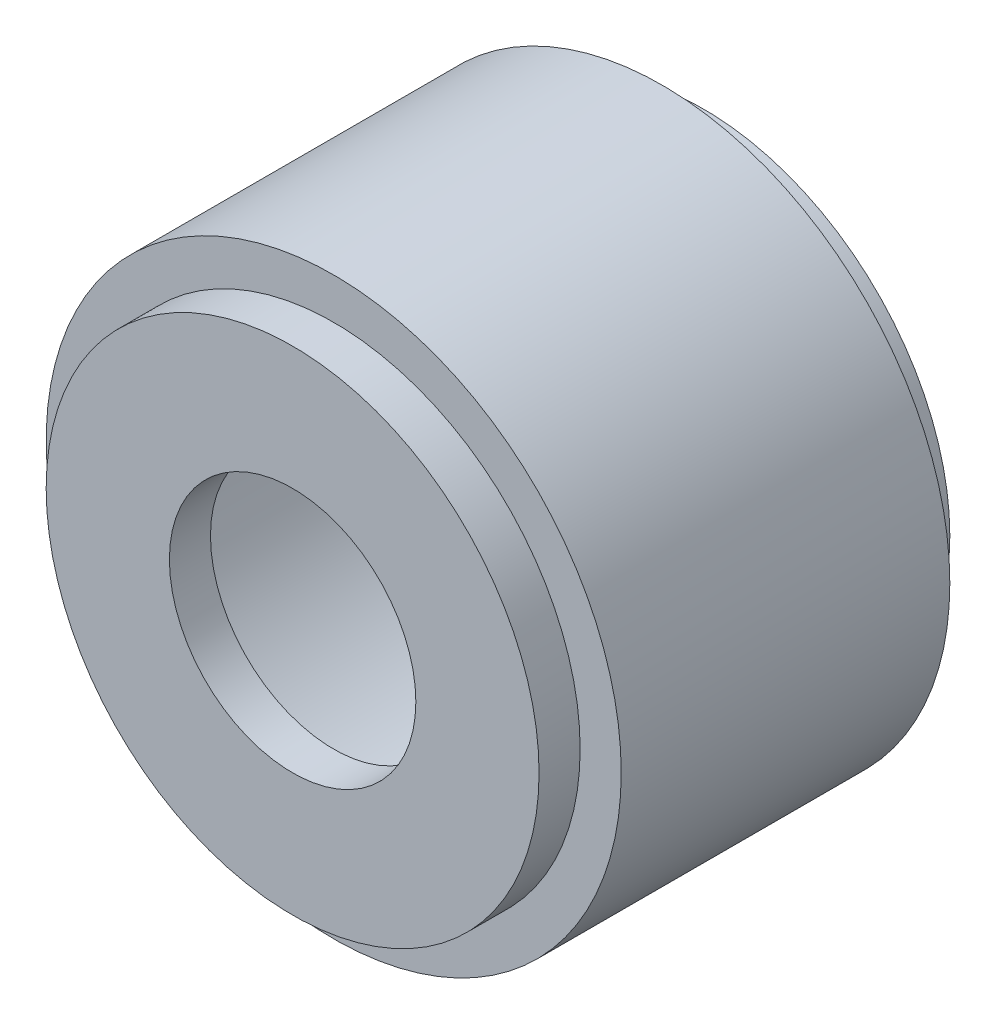
ISO-10303-21;
HEADER;
FILE_DESCRIPTION(('STEP AP214'),'2;1');
FILE_NAME('part.step','',(''),(''),'','','');
FILE_SCHEMA(('AUTOMOTIVE_DESIGN { 1 0 10303 214 1 1 1 1 }'));
ENDSEC;
DATA;
#1=APPLICATION_CONTEXT('core data for automotive mechanical design processes');
#2=APPLICATION_PROTOCOL_DEFINITION('international standard','automotive_design',2000,#1);
#3=PRODUCT_CONTEXT('',#1,'mechanical');
#4=PRODUCT('Part','Part','',(#3));
#5=PRODUCT_RELATED_PRODUCT_CATEGORY('part','',(#4));
#6=PRODUCT_DEFINITION_FORMATION('','',#4);
#7=PRODUCT_DEFINITION_CONTEXT('part definition',#1,'design');
#8=PRODUCT_DEFINITION('design','',#6,#7);
#9=PRODUCT_DEFINITION_SHAPE('','',#8);
#10=(LENGTH_UNIT() NAMED_UNIT(*) SI_UNIT(.MILLI.,.METRE.));
#11=(NAMED_UNIT(*) PLANE_ANGLE_UNIT() SI_UNIT($,.RADIAN.));
#12=(NAMED_UNIT(*) SI_UNIT($,.STERADIAN.) SOLID_ANGLE_UNIT());
#13=UNCERTAINTY_MEASURE_WITH_UNIT(LENGTH_MEASURE(1.E-05),#10,'distance_accuracy_value','');
#14=(GEOMETRIC_REPRESENTATION_CONTEXT(3) GLOBAL_UNCERTAINTY_ASSIGNED_CONTEXT((#13)) GLOBAL_UNIT_ASSIGNED_CONTEXT((#10,
#11,#12)) REPRESENTATION_CONTEXT('',''));
#15=CARTESIAN_POINT('',(0.,0.,0.));
#16=DIRECTION('',(0.,0.,1.));
#17=DIRECTION('',(1.,0.,0.));
#18=AXIS2_PLACEMENT_3D('',#15,#16,#17);
#19=CARTESIAN_POINT('',(0.,50.,-40.));
#20=DIRECTION('',(0.,0.,-1.));
#21=DIRECTION('',(-1.,0.,0.));
#22=AXIS2_PLACEMENT_3D('',#19,#20,#21);
#23=PLANE('',#22);
#24=CARTESIAN_POINT('',(0.,0.,-40.));
#25=DIRECTION('',(0.,0.,1.));
#26=DIRECTION('',(1.,0.,0.));
#27=AXIS2_PLACEMENT_3D('',#24,#25,#26);
#28=CIRCLE('',#27,50.);
#29=CARTESIAN_POINT('',(50.,0.,-40.));
#30=VERTEX_POINT('',#29);
#31=EDGE_CURVE('E77',#30,#30,#28,.T.);
#32=ORIENTED_EDGE('',*,*,#31,.T.);
#33=EDGE_LOOP('',(#32));
#34=FACE_BOUND('',#33,.T.);
#35=ADVANCED_FACE('F31',(#34),#23,.F.);
#36=CARTESIAN_POINT('',(0.,0.,-50.));
#37=DIRECTION('',(0.,0.,1.));
#38=DIRECTION('',(1.,0.,0.));
#39=AXIS2_PLACEMENT_3D('',#36,#37,#38);
#40=PLANE('',#39);
#41=CARTESIAN_POINT('',(0.,0.,-50.));
#42=DIRECTION('',(0.,0.,1.));
#43=DIRECTION('',(1.,0.,0.));
#44=AXIS2_PLACEMENT_3D('',#41,#42,#43);
#45=CIRCLE('',#44,60.);
#46=CARTESIAN_POINT('',(60.,0.,-50.));
#47=VERTEX_POINT('',#46);
#48=EDGE_CURVE('E10',#47,#47,#45,.T.);
#49=ORIENTED_EDGE('',*,*,#48,.F.);
#50=EDGE_LOOP('',(#49));
#51=FACE_BOUND('',#50,.T.);
#52=ADVANCED_FACE('F155',(#51),#40,.F.);
#53=CARTESIAN_POINT('',(0.,0.,147.034921683031));
#54=DIRECTION('',(0.,0.,1.));
#55=DIRECTION('',(1.,0.,0.));
#56=AXIS2_PLACEMENT_3D('',#53,#54,#55);
#57=CYLINDRICAL_SURFACE('',#56,60.);
#58=CARTESIAN_POINT('',(0.,0.,-40.));
#59=DIRECTION('',(0.,0.,1.));
#60=DIRECTION('',(1.,0.,0.));
#61=AXIS2_PLACEMENT_3D('',#58,#59,#60);
#62=CIRCLE('',#61,60.);
#63=CARTESIAN_POINT('',(60.,0.,-40.));
#64=VERTEX_POINT('',#63);
#65=EDGE_CURVE('E37',#64,#64,#62,.T.);
#66=ORIENTED_EDGE('',*,*,#65,.F.);
#67=EDGE_LOOP('',(#66));
#68=FACE_BOUND('',#67,.T.);
#69=ORIENTED_EDGE('',*,*,#48,.T.);
#70=EDGE_LOOP('',(#69));
#71=FACE_BOUND('',#70,.T.);
#72=ADVANCED_FACE('F150',(#68,#71),#57,.T.);
#73=CARTESIAN_POINT('',(0.,60.,-40.));
#74=DIRECTION('',(0.,0.,1.));
#75=DIRECTION('',(1.,0.,0.));
#76=AXIS2_PLACEMENT_3D('',#73,#74,#75);
#77=PLANE('',#76);
#78=CARTESIAN_POINT('',(0.,0.,-40.));
#79=DIRECTION('',(0.,0.,1.));
#80=DIRECTION('',(1.,0.,0.));
#81=AXIS2_PLACEMENT_3D('',#78,#79,#80);
#82=CIRCLE('',#81,70.0000000000001);
#83=CARTESIAN_POINT('',(70.0000000000001,0.,-40.));
#84=VERTEX_POINT('',#83);
#85=EDGE_CURVE('E41',#84,#84,#82,.T.);
#86=ORIENTED_EDGE('',*,*,#85,.F.);
#87=EDGE_LOOP('',(#86));
#88=FACE_BOUND('',#87,.T.);
#89=ORIENTED_EDGE('',*,*,#65,.T.);
#90=EDGE_LOOP('',(#89));
#91=FACE_BOUND('',#90,.T.);
#92=ADVANCED_FACE('F145',(#88,#91),#77,.F.);
#93=CARTESIAN_POINT('',(0.,0.,147.034921683031));
#94=DIRECTION('',(0.,0.,1.));
#95=DIRECTION('',(1.,0.,0.));
#96=AXIS2_PLACEMENT_3D('',#93,#94,#95);
#97=CYLINDRICAL_SURFACE('',#96,70.);
#98=CARTESIAN_POINT('',(0.,0.,40.));
#99=DIRECTION('',(0.,0.,1.));
#100=DIRECTION('',(1.,0.,0.));
#101=AXIS2_PLACEMENT_3D('',#98,#99,#100);
#102=CIRCLE('',#101,70.);
#103=CARTESIAN_POINT('',(70.,0.,40.));
#104=VERTEX_POINT('',#103);
#105=EDGE_CURVE('E45',#104,#104,#102,.T.);
#106=ORIENTED_EDGE('',*,*,#105,.F.);
#107=EDGE_LOOP('',(#106));
#108=FACE_BOUND('',#107,.T.);
#109=ORIENTED_EDGE('',*,*,#85,.T.);
#110=EDGE_LOOP('',(#109));
#111=FACE_BOUND('',#110,.T.);
#112=ADVANCED_FACE('F139',(#108,#111),#97,.T.);
#113=CARTESIAN_POINT('',(0.,70.,40.));
#114=DIRECTION('',(0.,0.,-1.));
#115=DIRECTION('',(-1.,0.,0.));
#116=AXIS2_PLACEMENT_3D('',#113,#114,#115);
#117=PLANE('',#116);
#118=CARTESIAN_POINT('',(0.,0.,40.));
#119=DIRECTION('',(0.,0.,1.));
#120=DIRECTION('',(1.,0.,0.));
#121=AXIS2_PLACEMENT_3D('',#118,#119,#120);
#122=CIRCLE('',#121,60.);
#123=CARTESIAN_POINT('',(60.,0.,40.));
#124=VERTEX_POINT('',#123);
#125=EDGE_CURVE('E50',#124,#124,#122,.T.);
#126=ORIENTED_EDGE('',*,*,#125,.F.);
#127=EDGE_LOOP('',(#126));
#128=FACE_BOUND('',#127,.T.);
#129=ORIENTED_EDGE('',*,*,#105,.T.);
#130=EDGE_LOOP('',(#129));
#131=FACE_BOUND('',#130,.T.);
#132=ADVANCED_FACE('F133',(#128,#131),#117,.F.);
#133=CARTESIAN_POINT('',(0.,0.,147.034921683031));
#134=DIRECTION('',(0.,0.,1.));
#135=DIRECTION('',(1.,0.,0.));
#136=AXIS2_PLACEMENT_3D('',#133,#134,#135);
#137=CYLINDRICAL_SURFACE('',#136,60.);
#138=CARTESIAN_POINT('',(0.,0.,50.));
#139=DIRECTION('',(0.,0.,1.));
#140=DIRECTION('',(1.,0.,0.));
#141=AXIS2_PLACEMENT_3D('',#138,#139,#140);
#142=CIRCLE('',#141,60.);
#143=CARTESIAN_POINT('',(60.,0.,50.));
#144=VERTEX_POINT('',#143);
#145=EDGE_CURVE('E53',#144,#144,#142,.T.);
#146=ORIENTED_EDGE('',*,*,#145,.F.);
#147=EDGE_LOOP('',(#146));
#148=FACE_BOUND('',#147,.T.);
#149=ORIENTED_EDGE('',*,*,#125,.T.);
#150=EDGE_LOOP('',(#149));
#151=FACE_BOUND('',#150,.T.);
#152=ADVANCED_FACE('F127',(#148,#151),#137,.T.);
#153=CARTESIAN_POINT('',(0.,60.,50.));
#154=DIRECTION('',(0.,0.,-1.));
#155=DIRECTION('',(-1.,0.,0.));
#156=AXIS2_PLACEMENT_3D('',#153,#154,#155);
#157=PLANE('',#156);
#158=CARTESIAN_POINT('',(0.,0.,50.));
#159=DIRECTION('',(0.,0.,1.));
#160=DIRECTION('',(1.,0.,0.));
#161=AXIS2_PLACEMENT_3D('',#158,#159,#160);
#162=CIRCLE('',#161,30.);
#163=CARTESIAN_POINT('',(30.,0.,50.));
#164=VERTEX_POINT('',#163);
#165=EDGE_CURVE('E56',#164,#164,#162,.T.);
#166=ORIENTED_EDGE('',*,*,#165,.F.);
#167=EDGE_LOOP('',(#166));
#168=FACE_BOUND('',#167,.T.);
#169=ORIENTED_EDGE('',*,*,#145,.T.);
#170=EDGE_LOOP('',(#169));
#171=FACE_BOUND('',#170,.T.);
#172=ADVANCED_FACE('F121',(#168,#171),#157,.F.);
#173=CARTESIAN_POINT('',(0.,0.,147.034921683031));
#174=DIRECTION('',(0.,0.,1.));
#175=DIRECTION('',(1.,0.,0.));
#176=AXIS2_PLACEMENT_3D('',#173,#174,#175);
#177=CYLINDRICAL_SURFACE('',#176,30.);
#178=CARTESIAN_POINT('',(0.,0.,40.));
#179=DIRECTION('',(0.,0.,1.));
#180=DIRECTION('',(1.,0.,0.));
#181=AXIS2_PLACEMENT_3D('',#178,#179,#180);
#182=CIRCLE('',#181,30.);
#183=CARTESIAN_POINT('',(30.,0.,40.));
#184=VERTEX_POINT('',#183);
#185=EDGE_CURVE('E59',#184,#184,#182,.T.);
#186=ORIENTED_EDGE('',*,*,#185,.F.);
#187=EDGE_LOOP('',(#186));
#188=FACE_BOUND('',#187,.T.);
#189=ORIENTED_EDGE('',*,*,#165,.T.);
#190=EDGE_LOOP('',(#189));
#191=FACE_BOUND('',#190,.T.);
#192=ADVANCED_FACE('F115',(#188,#191),#177,.F.);
#193=CARTESIAN_POINT('',(0.,30.,40.));
#194=DIRECTION('',(0.,0.,1.));
#195=DIRECTION('',(1.,0.,0.));
#196=AXIS2_PLACEMENT_3D('',#193,#194,#195);
#197=PLANE('',#196);
#198=CARTESIAN_POINT('',(0.,0.,40.));
#199=DIRECTION('',(0.,0.,1.));
#200=DIRECTION('',(1.,0.,0.));
#201=AXIS2_PLACEMENT_3D('',#198,#199,#200);
#202=CIRCLE('',#201,50.);
#203=CARTESIAN_POINT('',(50.,0.,40.));
#204=VERTEX_POINT('',#203);
#205=EDGE_CURVE('E62',#204,#204,#202,.T.);
#206=ORIENTED_EDGE('',*,*,#205,.F.);
#207=EDGE_LOOP('',(#206));
#208=FACE_BOUND('',#207,.T.);
#209=ORIENTED_EDGE('',*,*,#185,.T.);
#210=EDGE_LOOP('',(#209));
#211=FACE_BOUND('',#210,.T.);
#212=ADVANCED_FACE('F109',(#208,#211),#197,.F.);
#213=CARTESIAN_POINT('',(0.,0.,147.034921683031));
#214=DIRECTION('',(0.,0.,1.));
#215=DIRECTION('',(1.,0.,0.));
#216=AXIS2_PLACEMENT_3D('',#213,#214,#215);
#217=CYLINDRICAL_SURFACE('',#216,50.);
#218=CARTESIAN_POINT('',(0.,0.,30.));
#219=DIRECTION('',(0.,0.,1.));
#220=DIRECTION('',(1.,0.,0.));
#221=AXIS2_PLACEMENT_3D('',#218,#219,#220);
#222=CIRCLE('',#221,50.);
#223=CARTESIAN_POINT('',(50.,0.,30.));
#224=VERTEX_POINT('',#223);
#225=EDGE_CURVE('E65',#224,#224,#222,.T.);
#226=ORIENTED_EDGE('',*,*,#225,.F.);
#227=EDGE_LOOP('',(#226));
#228=FACE_BOUND('',#227,.T.);
#229=ORIENTED_EDGE('',*,*,#205,.T.);
#230=EDGE_LOOP('',(#229));
#231=FACE_BOUND('',#230,.T.);
#232=ADVANCED_FACE('F103',(#228,#231),#217,.F.);
#233=CARTESIAN_POINT('',(0.,50.,30.));
#234=DIRECTION('',(0.,0.,1.));
#235=DIRECTION('',(1.,0.,0.));
#236=AXIS2_PLACEMENT_3D('',#233,#234,#235);
#237=PLANE('',#236);
#238=CARTESIAN_POINT('',(0.,0.,30.));
#239=DIRECTION('',(0.,0.,1.));
#240=DIRECTION('',(1.,0.,0.));
#241=AXIS2_PLACEMENT_3D('',#238,#239,#240);
#242=CIRCLE('',#241,60.);
#243=CARTESIAN_POINT('',(60.,0.,30.));
#244=VERTEX_POINT('',#243);
#245=EDGE_CURVE('E68',#244,#244,#242,.T.);
#246=ORIENTED_EDGE('',*,*,#245,.F.);
#247=EDGE_LOOP('',(#246));
#248=FACE_BOUND('',#247,.T.);
#249=ORIENTED_EDGE('',*,*,#225,.T.);
#250=EDGE_LOOP('',(#249));
#251=FACE_BOUND('',#250,.T.);
#252=ADVANCED_FACE('F97',(#248,#251),#237,.F.);
#253=CARTESIAN_POINT('',(0.,0.,147.034921683031));
#254=DIRECTION('',(0.,0.,1.));
#255=DIRECTION('',(1.,0.,0.));
#256=AXIS2_PLACEMENT_3D('',#253,#254,#255);
#257=CYLINDRICAL_SURFACE('',#256,60.);
#258=CARTESIAN_POINT('',(0.,0.,-30.));
#259=DIRECTION('',(0.,0.,1.));
#260=DIRECTION('',(1.,0.,0.));
#261=AXIS2_PLACEMENT_3D('',#258,#259,#260);
#262=CIRCLE('',#261,60.);
#263=CARTESIAN_POINT('',(60.,0.,-30.));
#264=VERTEX_POINT('',#263);
#265=EDGE_CURVE('E71',#264,#264,#262,.T.);
#266=ORIENTED_EDGE('',*,*,#265,.F.);
#267=EDGE_LOOP('',(#266));
#268=FACE_BOUND('',#267,.T.);
#269=ORIENTED_EDGE('',*,*,#245,.T.);
#270=EDGE_LOOP('',(#269));
#271=FACE_BOUND('',#270,.T.);
#272=ADVANCED_FACE('F91',(#268,#271),#257,.F.);
#273=CARTESIAN_POINT('',(0.,60.,-30.));
#274=DIRECTION('',(0.,0.,-1.));
#275=DIRECTION('',(-1.,0.,0.));
#276=AXIS2_PLACEMENT_3D('',#273,#274,#275);
#277=PLANE('',#276);
#278=CARTESIAN_POINT('',(0.,0.,-30.));
#279=DIRECTION('',(0.,0.,1.));
#280=DIRECTION('',(1.,0.,0.));
#281=AXIS2_PLACEMENT_3D('',#278,#279,#280);
#282=CIRCLE('',#281,50.);
#283=CARTESIAN_POINT('',(50.,0.,-30.));
#284=VERTEX_POINT('',#283);
#285=EDGE_CURVE('E74',#284,#284,#282,.T.);
#286=ORIENTED_EDGE('',*,*,#285,.F.);
#287=EDGE_LOOP('',(#286));
#288=FACE_BOUND('',#287,.T.);
#289=ORIENTED_EDGE('',*,*,#265,.T.);
#290=EDGE_LOOP('',(#289));
#291=FACE_BOUND('',#290,.T.);
#292=ADVANCED_FACE('F85',(#288,#291),#277,.F.);
#293=CARTESIAN_POINT('',(0.,0.,147.034921683031));
#294=DIRECTION('',(0.,0.,1.));
#295=DIRECTION('',(1.,0.,0.));
#296=AXIS2_PLACEMENT_3D('',#293,#294,#295);
#297=CYLINDRICAL_SURFACE('',#296,50.);
#298=ORIENTED_EDGE('',*,*,#31,.F.);
#299=EDGE_LOOP('',(#298));
#300=FACE_BOUND('',#299,.T.);
#301=ORIENTED_EDGE('',*,*,#285,.T.);
#302=EDGE_LOOP('',(#301));
#303=FACE_BOUND('',#302,.T.);
#304=ADVANCED_FACE('F82',(#300,#303),#297,.F.);
#305=CLOSED_SHELL('',(#35,#52,#72,#92,#112,#132,#152,#172,#192,#212,#232,#252,#272,#292,#304));
#306=MANIFOLD_SOLID_BREP('B2',#305);
#307=ADVANCED_BREP_SHAPE_REPRESENTATION('',(#18,#306),#14);
#308=SHAPE_DEFINITION_REPRESENTATION(#9,#307);
ENDSEC;
END-ISO-10303-21;
